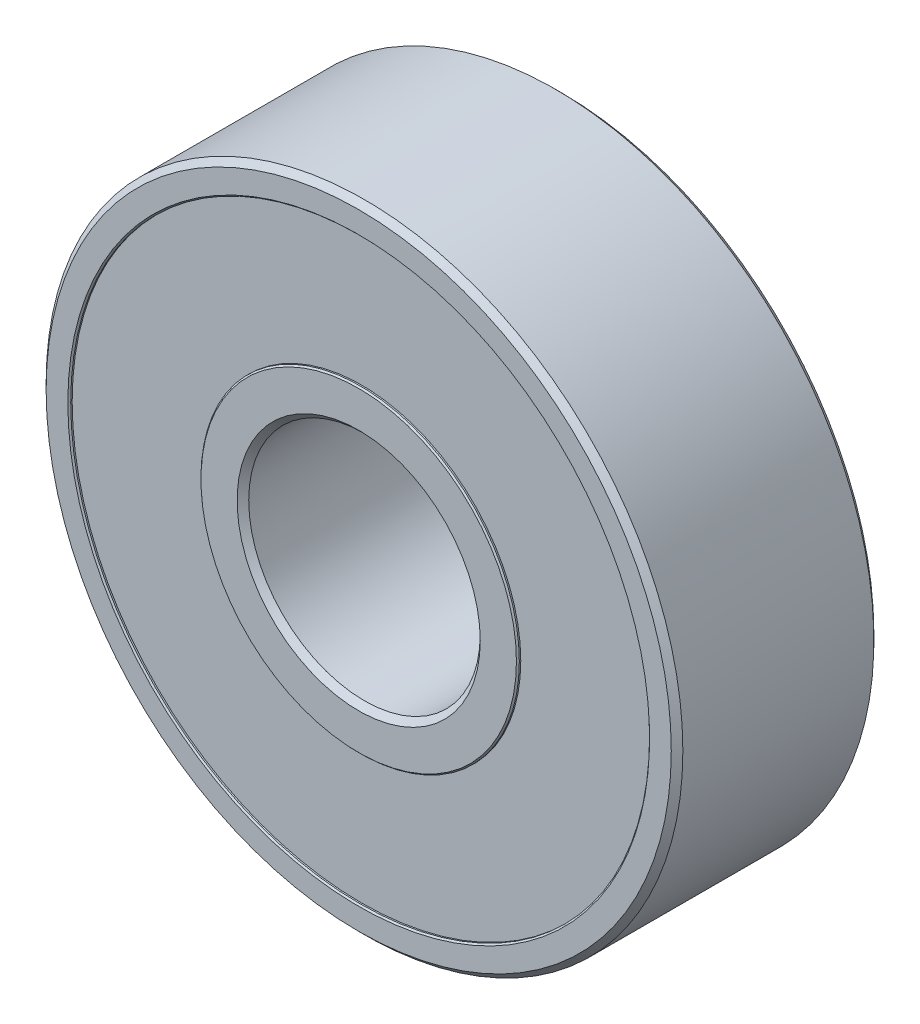
ISO-10303-21;
HEADER;
FILE_DESCRIPTION(('STEP AP214'),'2;1');
FILE_NAME('part.step','',(''),(''),'','','');
FILE_SCHEMA(('AUTOMOTIVE_DESIGN { 1 0 10303 214 1 1 1 1 }'));
ENDSEC;
DATA;
#1=APPLICATION_CONTEXT('core data for automotive mechanical design processes');
#2=APPLICATION_PROTOCOL_DEFINITION('international standard','automotive_design',2000,#1);
#3=PRODUCT_CONTEXT('',#1,'mechanical');
#4=PRODUCT('Part','Part','',(#3));
#5=PRODUCT_RELATED_PRODUCT_CATEGORY('part','',(#4));
#6=PRODUCT_DEFINITION_FORMATION('','',#4);
#7=PRODUCT_DEFINITION_CONTEXT('part definition',#1,'design');
#8=PRODUCT_DEFINITION('design','',#6,#7);
#9=PRODUCT_DEFINITION_SHAPE('','',#8);
#10=(LENGTH_UNIT() NAMED_UNIT(*) SI_UNIT(.MILLI.,.METRE.));
#11=(NAMED_UNIT(*) PLANE_ANGLE_UNIT() SI_UNIT($,.RADIAN.));
#12=(NAMED_UNIT(*) SI_UNIT($,.STERADIAN.) SOLID_ANGLE_UNIT());
#13=UNCERTAINTY_MEASURE_WITH_UNIT(LENGTH_MEASURE(1.E-05),#10,'distance_accuracy_value','');
#14=(GEOMETRIC_REPRESENTATION_CONTEXT(3) GLOBAL_UNCERTAINTY_ASSIGNED_CONTEXT((#13)) GLOBAL_UNIT_ASSIGNED_CONTEXT((#10,
#11,#12)) REPRESENTATION_CONTEXT('',''));
#15=CARTESIAN_POINT('',(0.,0.,0.));
#16=DIRECTION('',(0.,0.,1.));
#17=DIRECTION('',(1.,0.,0.));
#18=AXIS2_PLACEMENT_3D('',#15,#16,#17);
#19=CARTESIAN_POINT('',(0.,0.,0.1));
#20=DIRECTION('',(0.,0.,1.));
#21=DIRECTION('',(1.,0.,0.));
#22=AXIS2_PLACEMENT_3D('',#19,#20,#21);
#23=PLANE('',#22);
#24=CARTESIAN_POINT('',(0.,0.,0.1));
#25=DIRECTION('',(0.,0.,-1.));
#26=DIRECTION('',(1.,0.,0.));
#27=AXIS2_PLACEMENT_3D('',#24,#25,#26);
#28=CIRCLE('',#27,10.);
#29=CARTESIAN_POINT('',(10.,0.,0.1));
#30=VERTEX_POINT('',#29);
#31=EDGE_CURVE('E68',#30,#30,#28,.T.);
#32=ORIENTED_EDGE('',*,*,#31,.T.);
#33=EDGE_LOOP('',(#32));
#34=FACE_BOUND('',#33,.T.);
#35=CARTESIAN_POINT('',(0.,0.,0.1));
#36=DIRECTION('',(0.,0.,1.));
#37=DIRECTION('',(1.,0.,0.));
#38=AXIS2_PLACEMENT_3D('',#35,#36,#37);
#39=CIRCLE('',#38,5.5);
#40=CARTESIAN_POINT('',(5.5,0.,0.1));
#41=VERTEX_POINT('',#40);
#42=EDGE_CURVE('E62',#41,#41,#39,.F.);
#43=ORIENTED_EDGE('',*,*,#42,.F.);
#44=EDGE_LOOP('',(#43));
#45=FACE_BOUND('',#44,.T.);
#46=ADVANCED_FACE('F30',(#34,#45),#23,.F.);
#47=CARTESIAN_POINT('',(0.,0.,7.));
#48=DIRECTION('',(0.,0.,-1.));
#49=DIRECTION('',(-1.,0.,0.));
#50=AXIS2_PLACEMENT_3D('',#47,#48,#49);
#51=CYLINDRICAL_SURFACE('',#50,11.);
#52=CARTESIAN_POINT('',(0.,0.,0.199999999999997));
#53=DIRECTION('',(0.,0.,-1.));
#54=DIRECTION('',(-1.,0.,0.));
#55=AXIS2_PLACEMENT_3D('',#52,#53,#54);
#56=CIRCLE('',#55,11.);
#57=CARTESIAN_POINT('',(-11.,0.,0.199999999999997));
#58=VERTEX_POINT('',#57);
#59=EDGE_CURVE('E53',#58,#58,#56,.F.);
#60=ORIENTED_EDGE('',*,*,#59,.T.);
#61=EDGE_LOOP('',(#60));
#62=FACE_BOUND('',#61,.T.);
#63=CARTESIAN_POINT('',(0.,0.,6.8));
#64=DIRECTION('',(0.,0.,1.));
#65=DIRECTION('',(1.,0.,0.));
#66=AXIS2_PLACEMENT_3D('',#63,#64,#65);
#67=CIRCLE('',#66,11.);
#68=CARTESIAN_POINT('',(11.,0.,6.8));
#69=VERTEX_POINT('',#68);
#70=EDGE_CURVE('E56',#69,#69,#67,.F.);
#71=ORIENTED_EDGE('',*,*,#70,.T.);
#72=EDGE_LOOP('',(#71));
#73=FACE_BOUND('',#72,.T.);
#74=ADVANCED_FACE('F117',(#62,#73),#51,.T.);
#75=CARTESIAN_POINT('',(11.,0.,7.));
#76=DIRECTION('',(0.,0.,1.));
#77=DIRECTION('',(1.,0.,0.));
#78=AXIS2_PLACEMENT_3D('',#75,#76,#77);
#79=PLANE('',#78);
#80=CARTESIAN_POINT('',(0.,0.,7.));
#81=DIRECTION('',(0.,0.,1.));
#82=DIRECTION('',(1.,0.,0.));
#83=AXIS2_PLACEMENT_3D('',#80,#81,#82);
#84=CIRCLE('',#83,10.8);
#85=CARTESIAN_POINT('',(10.8,0.,7.));
#86=VERTEX_POINT('',#85);
#87=EDGE_CURVE('E50',#86,#86,#84,.T.);
#88=ORIENTED_EDGE('',*,*,#87,.T.);
#89=EDGE_LOOP('',(#88));
#90=FACE_BOUND('',#89,.T.);
#91=CARTESIAN_POINT('',(0.,0.,7.));
#92=DIRECTION('',(0.,0.,1.));
#93=DIRECTION('',(-1.,0.,0.));
#94=AXIS2_PLACEMENT_3D('',#91,#92,#93);
#95=CIRCLE('',#94,10.05);
#96=CARTESIAN_POINT('',(-10.05,0.,7.));
#97=VERTEX_POINT('',#96);
#98=EDGE_CURVE('E80',#97,#97,#95,.T.);
#99=ORIENTED_EDGE('',*,*,#98,.F.);
#100=EDGE_LOOP('',(#99));
#101=FACE_BOUND('',#100,.T.);
#102=ADVANCED_FACE('F123',(#90,#101),#79,.T.);
#103=CARTESIAN_POINT('',(0.,0.,0.));
#104=DIRECTION('',(0.,0.,-1.));
#105=DIRECTION('',(-1.,0.,0.));
#106=AXIS2_PLACEMENT_3D('',#103,#104,#105);
#107=PLANE('',#106);
#108=CARTESIAN_POINT('',(0.,0.,0.));
#109=DIRECTION('',(0.,0.,-1.));
#110=DIRECTION('',(-1.,0.,0.));
#111=AXIS2_PLACEMENT_3D('',#108,#109,#110);
#112=CIRCLE('',#111,10.8);
#113=CARTESIAN_POINT('',(-10.8,0.,0.));
#114=VERTEX_POINT('',#113);
#115=EDGE_CURVE('E59',#114,#114,#112,.T.);
#116=ORIENTED_EDGE('',*,*,#115,.T.);
#117=EDGE_LOOP('',(#116));
#118=FACE_BOUND('',#117,.T.);
#119=CARTESIAN_POINT('',(0.,0.,0.));
#120=DIRECTION('',(0.,0.,-1.));
#121=DIRECTION('',(1.,0.,0.));
#122=AXIS2_PLACEMENT_3D('',#119,#120,#121);
#123=CIRCLE('',#122,10.05);
#124=CARTESIAN_POINT('',(10.05,0.,0.));
#125=VERTEX_POINT('',#124);
#126=EDGE_CURVE('E65',#125,#125,#123,.T.);
#127=ORIENTED_EDGE('',*,*,#126,.F.);
#128=EDGE_LOOP('',(#127));
#129=FACE_BOUND('',#128,.T.);
#130=ADVANCED_FACE('F138',(#118,#129),#107,.T.);
#131=CARTESIAN_POINT('',(0.,0.,0.));
#132=DIRECTION('',(0.,0.,-1.));
#133=DIRECTION('',(1.,0.,0.));
#134=AXIS2_PLACEMENT_3D('',#131,#132,#133);
#135=CONICAL_SURFACE('',#134,10.05,0.785398163397427);
#136=CARTESIAN_POINT('',(0.,0.,0.0499999999999962));
#137=DIRECTION('',(0.,0.,-1.));
#138=DIRECTION('',(1.,0.,0.));
#139=AXIS2_PLACEMENT_3D('',#136,#137,#138);
#140=CIRCLE('',#139,10.);
#141=CARTESIAN_POINT('',(10.,0.,0.0499999999999962));
#142=VERTEX_POINT('',#141);
#143=EDGE_CURVE('E69',#142,#142,#140,.T.);
#144=ORIENTED_EDGE('',*,*,#143,.F.);
#145=EDGE_LOOP('',(#144));
#146=FACE_BOUND('',#145,.T.);
#147=ORIENTED_EDGE('',*,*,#126,.T.);
#148=EDGE_LOOP('',(#147));
#149=FACE_BOUND('',#148,.T.);
#150=ADVANCED_FACE('F134',(#146,#149),#135,.F.);
#151=CARTESIAN_POINT('',(0.,0.,0.1));
#152=DIRECTION('',(0.,0.,-1.));
#153=DIRECTION('',(-1.,0.,0.));
#154=AXIS2_PLACEMENT_3D('',#151,#152,#153);
#155=CYLINDRICAL_SURFACE('',#154,10.);
#156=ORIENTED_EDGE('',*,*,#31,.F.);
#157=EDGE_LOOP('',(#156));
#158=FACE_BOUND('',#157,.T.);
#159=ORIENTED_EDGE('',*,*,#143,.T.);
#160=EDGE_LOOP('',(#159));
#161=FACE_BOUND('',#160,.T.);
#162=ADVANCED_FACE('F131',(#158,#161),#155,.F.);
#163=CARTESIAN_POINT('',(0.,0.,0.0499999999999945));
#164=DIRECTION('',(0.,0.,1.));
#165=DIRECTION('',(1.,0.,0.));
#166=AXIS2_PLACEMENT_3D('',#163,#164,#165);
#167=CYLINDRICAL_SURFACE('',#166,5.5);
#168=CARTESIAN_POINT('',(0.,0.,0.0499999999999945));
#169=DIRECTION('',(0.,0.,-1.));
#170=DIRECTION('',(-1.,0.,0.));
#171=AXIS2_PLACEMENT_3D('',#168,#169,#170);
#172=CIRCLE('',#171,5.5);
#173=CARTESIAN_POINT('',(-5.5,0.,0.0499999999999945));
#174=VERTEX_POINT('',#173);
#175=EDGE_CURVE('E72',#174,#174,#172,.T.);
#176=ORIENTED_EDGE('',*,*,#175,.F.);
#177=EDGE_LOOP('',(#176));
#178=FACE_BOUND('',#177,.T.);
#179=ORIENTED_EDGE('',*,*,#42,.T.);
#180=EDGE_LOOP('',(#179));
#181=FACE_BOUND('',#180,.T.);
#182=ADVANCED_FACE('F129',(#178,#181),#167,.T.);
#183=CARTESIAN_POINT('',(0.,0.,0.0499999999999945));
#184=DIRECTION('',(0.,0.,1.));
#185=DIRECTION('',(-1.,0.,0.));
#186=AXIS2_PLACEMENT_3D('',#183,#184,#185);
#187=CONICAL_SURFACE('',#186,5.5,0.785398163397462);
#188=CARTESIAN_POINT('',(0.,0.,0.));
#189=DIRECTION('',(0.,0.,-1.));
#190=DIRECTION('',(-1.,0.,0.));
#191=AXIS2_PLACEMENT_3D('',#188,#189,#190);
#192=CIRCLE('',#191,5.45);
#193=CARTESIAN_POINT('',(-5.45,0.,0.));
#194=VERTEX_POINT('',#193);
#195=EDGE_CURVE('E77',#194,#194,#192,.T.);
#196=ORIENTED_EDGE('',*,*,#195,.F.);
#197=EDGE_LOOP('',(#196));
#198=FACE_BOUND('',#197,.T.);
#199=ORIENTED_EDGE('',*,*,#175,.T.);
#200=EDGE_LOOP('',(#199));
#201=FACE_BOUND('',#200,.T.);
#202=ADVANCED_FACE('F168',(#198,#201),#187,.T.);
#203=CARTESIAN_POINT('',(0.,0.,0.));
#204=DIRECTION('',(0.,0.,-1.));
#205=DIRECTION('',(-1.,0.,0.));
#206=AXIS2_PLACEMENT_3D('',#203,#204,#205);
#207=PLANE('',#206);
#208=CARTESIAN_POINT('',(0.,0.,0.));
#209=DIRECTION('',(0.,0.,-1.));
#210=DIRECTION('',(-1.,0.,0.));
#211=AXIS2_PLACEMENT_3D('',#208,#209,#210);
#212=CIRCLE('',#211,4.19999999999998);
#213=CARTESIAN_POINT('',(-4.19999999999998,0.,0.));
#214=VERTEX_POINT('',#213);
#215=EDGE_CURVE('E45',#214,#214,#212,.F.);
#216=ORIENTED_EDGE('',*,*,#215,.T.);
#217=EDGE_LOOP('',(#216));
#218=FACE_BOUND('',#217,.T.);
#219=ORIENTED_EDGE('',*,*,#195,.T.);
#220=EDGE_LOOP('',(#219));
#221=FACE_BOUND('',#220,.T.);
#222=ADVANCED_FACE('F164',(#218,#221),#207,.T.);
#223=CARTESIAN_POINT('',(0.,0.,7.));
#224=DIRECTION('',(0.,0.,1.));
#225=DIRECTION('',(-1.,0.,0.));
#226=AXIS2_PLACEMENT_3D('',#223,#224,#225);
#227=CONICAL_SURFACE('',#226,10.05,0.785398163397445);
#228=CARTESIAN_POINT('',(0.,0.,6.95));
#229=DIRECTION('',(0.,0.,1.));
#230=DIRECTION('',(-1.,0.,0.));
#231=AXIS2_PLACEMENT_3D('',#228,#229,#230);
#232=CIRCLE('',#231,10.);
#233=CARTESIAN_POINT('',(-10.,0.,6.95));
#234=VERTEX_POINT('',#233);
#235=EDGE_CURVE('E84',#234,#234,#232,.T.);
#236=ORIENTED_EDGE('',*,*,#235,.F.);
#237=EDGE_LOOP('',(#236));
#238=FACE_BOUND('',#237,.T.);
#239=ORIENTED_EDGE('',*,*,#98,.T.);
#240=EDGE_LOOP('',(#239));
#241=FACE_BOUND('',#240,.T.);
#242=ADVANCED_FACE('F167',(#238,#241),#227,.F.);
#243=CARTESIAN_POINT('',(0.,0.,6.9));
#244=DIRECTION('',(0.,0.,1.));
#245=DIRECTION('',(1.,0.,0.));
#246=AXIS2_PLACEMENT_3D('',#243,#244,#245);
#247=CYLINDRICAL_SURFACE('',#246,10.);
#248=CARTESIAN_POINT('',(0.,0.,6.9));
#249=DIRECTION('',(0.,0.,1.));
#250=DIRECTION('',(-1.,0.,0.));
#251=AXIS2_PLACEMENT_3D('',#248,#249,#250);
#252=CIRCLE('',#251,10.);
#253=CARTESIAN_POINT('',(-10.,0.,6.9));
#254=VERTEX_POINT('',#253);
#255=EDGE_CURVE('E83',#254,#254,#252,.T.);
#256=ORIENTED_EDGE('',*,*,#255,.F.);
#257=EDGE_LOOP('',(#256));
#258=FACE_BOUND('',#257,.T.);
#259=ORIENTED_EDGE('',*,*,#235,.T.);
#260=EDGE_LOOP('',(#259));
#261=FACE_BOUND('',#260,.T.);
#262=ADVANCED_FACE('F113',(#258,#261),#247,.F.);
#263=CARTESIAN_POINT('',(0.,0.,6.9));
#264=DIRECTION('',(0.,0.,-1.));
#265=DIRECTION('',(-1.,0.,0.));
#266=AXIS2_PLACEMENT_3D('',#263,#264,#265);
#267=PLANE('',#266);
#268=CARTESIAN_POINT('',(0.,0.,6.9));
#269=DIRECTION('',(0.,0.,1.));
#270=DIRECTION('',(1.,0.,0.));
#271=AXIS2_PLACEMENT_3D('',#268,#269,#270);
#272=CIRCLE('',#271,5.5);
#273=CARTESIAN_POINT('',(5.5,0.,6.9));
#274=VERTEX_POINT('',#273);
#275=EDGE_CURVE('E87',#274,#274,#272,.T.);
#276=ORIENTED_EDGE('',*,*,#275,.F.);
#277=EDGE_LOOP('',(#276));
#278=FACE_BOUND('',#277,.T.);
#279=ORIENTED_EDGE('',*,*,#255,.T.);
#280=EDGE_LOOP('',(#279));
#281=FACE_BOUND('',#280,.T.);
#282=ADVANCED_FACE('F105',(#278,#281),#267,.F.);
#283=CARTESIAN_POINT('',(0.,0.,6.9));
#284=DIRECTION('',(0.,0.,1.));
#285=DIRECTION('',(1.,0.,0.));
#286=AXIS2_PLACEMENT_3D('',#283,#284,#285);
#287=CYLINDRICAL_SURFACE('',#286,5.5);
#288=ORIENTED_EDGE('',*,*,#275,.T.);
#289=EDGE_LOOP('',(#288));
#290=FACE_BOUND('',#289,.T.);
#291=CARTESIAN_POINT('',(0.,0.,6.95));
#292=DIRECTION('',(0.,0.,1.));
#293=DIRECTION('',(1.,0.,0.));
#294=AXIS2_PLACEMENT_3D('',#291,#292,#293);
#295=CIRCLE('',#294,5.5);
#296=CARTESIAN_POINT('',(5.5,0.,6.95));
#297=VERTEX_POINT('',#296);
#298=EDGE_CURVE('E95',#297,#297,#295,.T.);
#299=ORIENTED_EDGE('',*,*,#298,.F.);
#300=EDGE_LOOP('',(#299));
#301=FACE_BOUND('',#300,.T.);
#302=ADVANCED_FACE('F102',(#290,#301),#287,.T.);
#303=CARTESIAN_POINT('',(0.,0.,7.));
#304=DIRECTION('',(0.,0.,1.));
#305=DIRECTION('',(1.,0.,0.));
#306=AXIS2_PLACEMENT_3D('',#303,#304,#305);
#307=PLANE('',#306);
#308=CARTESIAN_POINT('',(0.,0.,7.));
#309=DIRECTION('',(0.,0.,1.));
#310=DIRECTION('',(1.,0.,0.));
#311=AXIS2_PLACEMENT_3D('',#308,#309,#310);
#312=CIRCLE('',#311,4.19999999999999);
#313=CARTESIAN_POINT('',(4.19999999999999,0.,7.));
#314=VERTEX_POINT('',#313);
#315=EDGE_CURVE('E10',#314,#314,#312,.F.);
#316=ORIENTED_EDGE('',*,*,#315,.T.);
#317=EDGE_LOOP('',(#316));
#318=FACE_BOUND('',#317,.T.);
#319=CARTESIAN_POINT('',(0.,0.,7.));
#320=DIRECTION('',(0.,0.,1.));
#321=DIRECTION('',(1.,0.,0.));
#322=AXIS2_PLACEMENT_3D('',#319,#320,#321);
#323=CIRCLE('',#322,5.45);
#324=CARTESIAN_POINT('',(5.45,0.,7.));
#325=VERTEX_POINT('',#324);
#326=EDGE_CURVE('E92',#325,#325,#323,.T.);
#327=ORIENTED_EDGE('',*,*,#326,.T.);
#328=EDGE_LOOP('',(#327));
#329=FACE_BOUND('',#328,.T.);
#330=ADVANCED_FACE('F104',(#318,#329),#307,.T.);
#331=CARTESIAN_POINT('',(0.,0.,7.));
#332=DIRECTION('',(0.,0.,-1.));
#333=DIRECTION('',(-1.,0.,0.));
#334=AXIS2_PLACEMENT_3D('',#331,#332,#333);
#335=CONICAL_SURFACE('',#334,5.45,0.78539816339744);
#336=ORIENTED_EDGE('',*,*,#298,.T.);
#337=EDGE_LOOP('',(#336));
#338=FACE_BOUND('',#337,.T.);
#339=ORIENTED_EDGE('',*,*,#326,.F.);
#340=EDGE_LOOP('',(#339));
#341=FACE_BOUND('',#340,.T.);
#342=ADVANCED_FACE('F99',(#338,#341),#335,.T.);
#343=CARTESIAN_POINT('',(0.,0.,7.));
#344=DIRECTION('',(0.,0.,1.));
#345=DIRECTION('',(1.,0.,0.));
#346=AXIS2_PLACEMENT_3D('',#343,#344,#345);
#347=CYLINDRICAL_SURFACE('',#346,3.99999999999999);
#348=CARTESIAN_POINT('',(0.,0.,0.199999999999993));
#349=DIRECTION('',(0.,0.,-1.));
#350=DIRECTION('',(-1.,0.,0.));
#351=AXIS2_PLACEMENT_3D('',#348,#349,#350);
#352=CIRCLE('',#351,3.99999999999999);
#353=CARTESIAN_POINT('',(-3.99999999999999,0.,0.199999999999993));
#354=VERTEX_POINT('',#353);
#355=EDGE_CURVE('E37',#354,#354,#352,.T.);
#356=ORIENTED_EDGE('',*,*,#355,.T.);
#357=EDGE_LOOP('',(#356));
#358=FACE_BOUND('',#357,.T.);
#359=CARTESIAN_POINT('',(0.,0.,6.80000000000001));
#360=DIRECTION('',(0.,0.,1.));
#361=DIRECTION('',(1.,0.,0.));
#362=AXIS2_PLACEMENT_3D('',#359,#360,#361);
#363=CIRCLE('',#362,3.99999999999999);
#364=CARTESIAN_POINT('',(3.99999999999999,0.,6.80000000000001));
#365=VERTEX_POINT('',#364);
#366=EDGE_CURVE('E41',#365,#365,#363,.T.);
#367=ORIENTED_EDGE('',*,*,#366,.T.);
#368=EDGE_LOOP('',(#367));
#369=FACE_BOUND('',#368,.T.);
#370=ADVANCED_FACE('F150',(#358,#369),#347,.F.);
#371=CARTESIAN_POINT('',(0.,0.,0.));
#372=DIRECTION('',(0.,0.,1.));
#373=DIRECTION('',(1.,0.,0.));
#374=AXIS2_PLACEMENT_3D('',#371,#372,#373);
#375=CONICAL_SURFACE('',#374,10.8,0.785398163397444);
#376=ORIENTED_EDGE('',*,*,#59,.F.);
#377=EDGE_LOOP('',(#376));
#378=FACE_BOUND('',#377,.T.);
#379=ORIENTED_EDGE('',*,*,#115,.F.);
#380=EDGE_LOOP('',(#379));
#381=FACE_BOUND('',#380,.T.);
#382=ADVANCED_FACE('F146',(#378,#381),#375,.T.);
#383=CARTESIAN_POINT('',(0.,0.,6.8));
#384=DIRECTION('',(0.,0.,-1.));
#385=DIRECTION('',(-1.,0.,0.));
#386=AXIS2_PLACEMENT_3D('',#383,#384,#385);
#387=CONICAL_SURFACE('',#386,11.,0.785398163397453);
#388=ORIENTED_EDGE('',*,*,#87,.F.);
#389=EDGE_LOOP('',(#388));
#390=FACE_BOUND('',#389,.T.);
#391=ORIENTED_EDGE('',*,*,#70,.F.);
#392=EDGE_LOOP('',(#391));
#393=FACE_BOUND('',#392,.T.);
#394=ADVANCED_FACE('F149',(#390,#393),#387,.T.);
#395=CARTESIAN_POINT('',(0.,0.,0.));
#396=DIRECTION('',(0.,0.,-1.));
#397=DIRECTION('',(-1.,0.,0.));
#398=AXIS2_PLACEMENT_3D('',#395,#396,#397);
#399=CONICAL_SURFACE('',#398,4.19999999999998,0.785398163397442);
#400=ORIENTED_EDGE('',*,*,#355,.F.);
#401=EDGE_LOOP('',(#400));
#402=FACE_BOUND('',#401,.T.);
#403=ORIENTED_EDGE('',*,*,#215,.F.);
#404=EDGE_LOOP('',(#403));
#405=FACE_BOUND('',#404,.T.);
#406=ADVANCED_FACE('F153',(#402,#405),#399,.F.);
#407=CARTESIAN_POINT('',(0.,0.,6.80000000000001));
#408=DIRECTION('',(0.,0.,1.));
#409=DIRECTION('',(1.,0.,0.));
#410=AXIS2_PLACEMENT_3D('',#407,#408,#409);
#411=CONICAL_SURFACE('',#410,3.99999999999999,0.785398163397455);
#412=CARTESIAN_POINT('',(4.19999999999999,0.,7.));
#413=CARTESIAN_POINT('',(4.19791666666665,0.,6.99791666666667));
#414=CARTESIAN_POINT('',(4.19583333333332,0.,6.99583333333333));
#415=CARTESIAN_POINT('',(4.19166666666665,0.,6.99166666666667));
#416=CARTESIAN_POINT('',(4.18958333333332,0.,6.98958333333333));
#417=CARTESIAN_POINT('',(4.18541666666665,0.,6.98541666666667));
#418=CARTESIAN_POINT('',(4.18333333333332,0.,6.98333333333333));
#419=CARTESIAN_POINT('',(4.17916666666665,0.,6.97916666666667));
#420=CARTESIAN_POINT('',(4.17708333333332,0.,6.97708333333333));
#421=CARTESIAN_POINT('',(4.17291666666665,0.,6.97291666666667));
#422=CARTESIAN_POINT('',(4.17083333333332,0.,6.97083333333333));
#423=CARTESIAN_POINT('',(4.16666666666665,0.,6.96666666666667));
#424=CARTESIAN_POINT('',(4.16458333333332,0.,6.96458333333333));
#425=CARTESIAN_POINT('',(4.16041666666665,0.,6.96041666666667));
#426=CARTESIAN_POINT('',(4.15833333333332,0.,6.95833333333333));
#427=CARTESIAN_POINT('',(4.15416666666665,0.,6.95416666666667));
#428=CARTESIAN_POINT('',(4.15208333333332,0.,6.95208333333333));
#429=CARTESIAN_POINT('',(4.14791666666665,0.,6.94791666666667));
#430=CARTESIAN_POINT('',(4.14583333333332,0.,6.94583333333333));
#431=CARTESIAN_POINT('',(4.14166666666665,0.,6.94166666666667));
#432=CARTESIAN_POINT('',(4.13958333333332,0.,6.93958333333333));
#433=CARTESIAN_POINT('',(4.13541666666665,0.,6.93541666666667));
#434=CARTESIAN_POINT('',(4.13333333333332,0.,6.93333333333333));
#435=CARTESIAN_POINT('',(4.12916666666665,0.,6.92916666666667));
#436=CARTESIAN_POINT('',(4.12708333333332,0.,6.92708333333333));
#437=CARTESIAN_POINT('',(4.12291666666665,0.,6.92291666666667));
#438=CARTESIAN_POINT('',(4.12083333333332,0.,6.92083333333334));
#439=CARTESIAN_POINT('',(4.11666666666665,0.,6.91666666666667));
#440=CARTESIAN_POINT('',(4.11458333333332,0.,6.91458333333333));
#441=CARTESIAN_POINT('',(4.11041666666665,0.,6.91041666666667));
#442=CARTESIAN_POINT('',(4.10833333333332,0.,6.90833333333334));
#443=CARTESIAN_POINT('',(4.10416666666665,0.,6.90416666666667));
#444=CARTESIAN_POINT('',(4.10208333333332,0.,6.90208333333334));
#445=CARTESIAN_POINT('',(4.09791666666665,0.,6.89791666666667));
#446=CARTESIAN_POINT('',(4.09583333333332,0.,6.89583333333334));
#447=CARTESIAN_POINT('',(4.09166666666665,0.,6.89166666666667));
#448=CARTESIAN_POINT('',(4.08958333333332,0.,6.88958333333334));
#449=CARTESIAN_POINT('',(4.08541666666665,0.,6.88541666666667));
#450=CARTESIAN_POINT('',(4.08333333333332,0.,6.88333333333334));
#451=CARTESIAN_POINT('',(4.07916666666665,0.,6.87916666666667));
#452=CARTESIAN_POINT('',(4.07708333333332,0.,6.87708333333334));
#453=CARTESIAN_POINT('',(4.07291666666665,0.,6.87291666666667));
#454=CARTESIAN_POINT('',(4.07083333333332,0.,6.87083333333334));
#455=CARTESIAN_POINT('',(4.06666666666665,0.,6.86666666666667));
#456=CARTESIAN_POINT('',(4.06458333333332,0.,6.86458333333334));
#457=CARTESIAN_POINT('',(4.06041666666665,0.,6.86041666666667));
#458=CARTESIAN_POINT('',(4.05833333333332,0.,6.85833333333334));
#459=CARTESIAN_POINT('',(4.05416666666665,0.,6.85416666666667));
#460=CARTESIAN_POINT('',(4.05208333333332,0.,6.85208333333334));
#461=CARTESIAN_POINT('',(4.04791666666665,0.,6.84791666666667));
#462=CARTESIAN_POINT('',(4.04583333333332,0.,6.84583333333334));
#463=CARTESIAN_POINT('',(4.04166666666665,0.,6.84166666666667));
#464=CARTESIAN_POINT('',(4.03958333333332,0.,6.83958333333334));
#465=CARTESIAN_POINT('',(4.03541666666665,0.,6.83541666666667));
#466=CARTESIAN_POINT('',(4.03333333333332,0.,6.83333333333334));
#467=CARTESIAN_POINT('',(4.02916666666665,0.,6.82916666666667));
#468=CARTESIAN_POINT('',(4.02708333333332,0.,6.82708333333334));
#469=CARTESIAN_POINT('',(4.02291666666665,0.,6.82291666666667));
#470=CARTESIAN_POINT('',(4.02083333333332,0.,6.82083333333334));
#471=CARTESIAN_POINT('',(4.01666666666665,0.,6.81666666666667));
#472=CARTESIAN_POINT('',(4.01458333333332,0.,6.81458333333334));
#473=CARTESIAN_POINT('',(4.01041666666665,0.,6.81041666666667));
#474=CARTESIAN_POINT('',(4.00833333333332,0.,6.80833333333334));
#475=CARTESIAN_POINT('',(4.00416666666665,0.,6.80416666666667));
#476=CARTESIAN_POINT('',(4.00208333333332,0.,6.80208333333334));
#477=CARTESIAN_POINT('',(3.99999999999999,0.,6.80000000000001));
#478=B_SPLINE_CURVE_WITH_KNOTS('',3,(#412,#413,#414,#415,#416,#417,#418,#419,#420,#421,#422,
#423,#424,#425,#426,#427,#428,#429,#430,#431,#432,#433,#434,#435,#436,#437,#438,#439,#440,#441,
#442,#443,#444,#445,#446,#447,#448,#449,#450,#451,#452,#453,#454,#455,#456,#457,#458,#459,#460,
#461,#462,#463,#464,#465,#466,#467,#468,#469,#470,#471,#472,#473,#474,#475,#476,#477),
.UNSPECIFIED.,.F.,.F.,(4,2,2,2,2,2,2,2,2,2,2,2,2,2,2,2,2,2,2,2,2,2,2,2,2,2,2,2,2,2,2,2,4),(0.,
0.0088388347648321,0.0176776695296642,0.0265165042944951,0.0353553390593272,0.0441941738241586,
0.0530330085889907,0.0618718433538222,0.0707106781186537,0.0795495128834858,0.0883883476483167,
0.0972271824131488,0.106066017177981,0.114904851942812,0.123743686707644,0.132582521472475,
0.141421356237307,0.150260191002139,0.15909902576697,0.167937860531802,0.176776695296633,
0.185615530061465,0.194454364826298,0.203293199591128,0.212132034355961,0.220970869120792,
0.229809703885623,0.238648538650456,0.247487373415287,0.256326208180119,0.26516504294495,
0.274003877709782,0.282842712474614),.UNSPECIFIED.);
#479=EDGE_CURVE('BSEAM32',#314,#365,#478,.T.);
#480=ORIENTED_EDGE('',*,*,#315,.F.);
#481=ORIENTED_EDGE('',*,*,#366,.F.);
#482=ORIENTED_EDGE('',*,*,#479,.T.);
#483=ORIENTED_EDGE('',*,*,#479,.F.);
#484=EDGE_LOOP('',(#480,#482,#481,#483));
#485=FACE_BOUND('',#484,.T.);
#486=ADVANCED_FACE('F32',(#485),#411,.F.);
#487=CLOSED_SHELL('',(#46,#74,#102,#130,#150,#162,#182,#202,#222,#242,#262,#282,#302,#330,#342,
#370,#382,#394,#406,#486));
#488=MANIFOLD_SOLID_BREP('B2',#487);
#489=ADVANCED_BREP_SHAPE_REPRESENTATION('',(#18,#488),#14);
#490=SHAPE_DEFINITION_REPRESENTATION(#9,#489);
ENDSEC;
END-ISO-10303-21;
